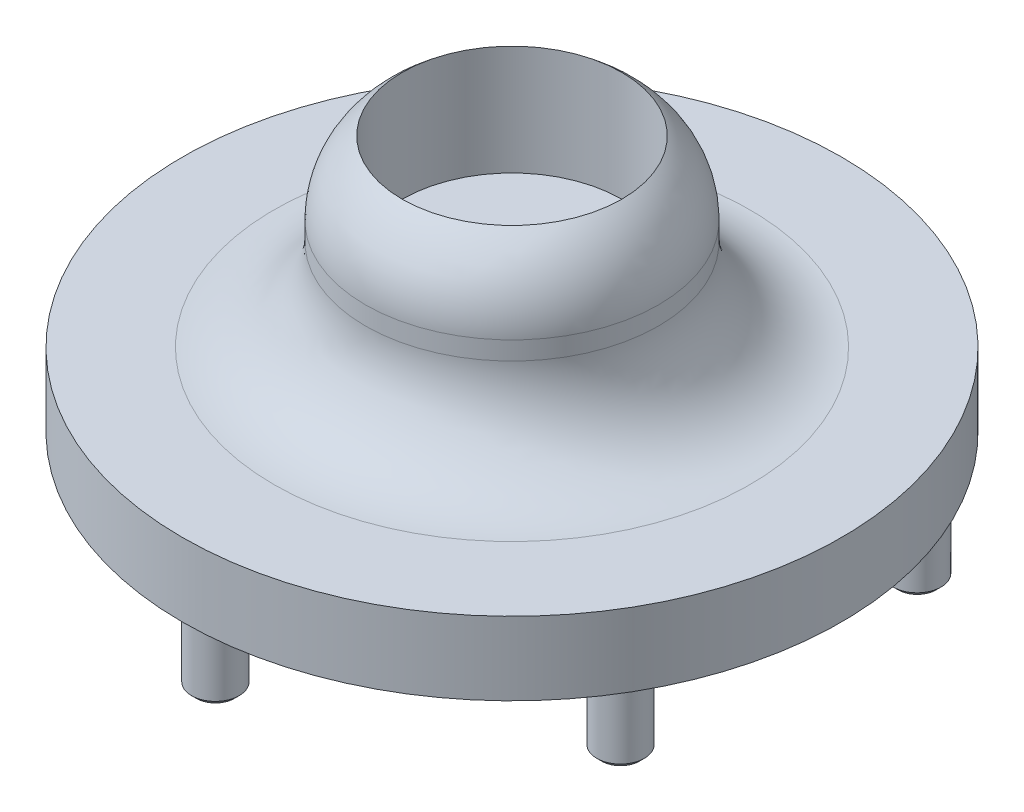
ISO-10303-21;
HEADER;
FILE_DESCRIPTION(('STEP AP214'),'2;1');
FILE_NAME('part.step','',(''),(''),'','','');
FILE_SCHEMA(('AUTOMOTIVE_DESIGN { 1 0 10303 214 1 1 1 1 }'));
ENDSEC;
DATA;
#1=APPLICATION_CONTEXT('core data for automotive mechanical design processes');
#2=APPLICATION_PROTOCOL_DEFINITION('international standard','automotive_design',2000,#1);
#3=PRODUCT_CONTEXT('',#1,'mechanical');
#4=PRODUCT('Part','Part','',(#3));
#5=PRODUCT_RELATED_PRODUCT_CATEGORY('part','',(#4));
#6=PRODUCT_DEFINITION_FORMATION('','',#4);
#7=PRODUCT_DEFINITION_CONTEXT('part definition',#1,'design');
#8=PRODUCT_DEFINITION('design','',#6,#7);
#9=PRODUCT_DEFINITION_SHAPE('','',#8);
#10=(LENGTH_UNIT() NAMED_UNIT(*) SI_UNIT(.MILLI.,.METRE.));
#11=(NAMED_UNIT(*) PLANE_ANGLE_UNIT() SI_UNIT($,.RADIAN.));
#12=(NAMED_UNIT(*) SI_UNIT($,.STERADIAN.) SOLID_ANGLE_UNIT());
#13=UNCERTAINTY_MEASURE_WITH_UNIT(LENGTH_MEASURE(1.E-05),#10,'distance_accuracy_value','');
#14=(GEOMETRIC_REPRESENTATION_CONTEXT(3) GLOBAL_UNCERTAINTY_ASSIGNED_CONTEXT((#13)) GLOBAL_UNIT_ASSIGNED_CONTEXT((#10,
#11,#12)) REPRESENTATION_CONTEXT('',''));
#15=CARTESIAN_POINT('',(0.,0.,0.));
#16=DIRECTION('',(0.,0.,1.));
#17=DIRECTION('',(1.,0.,0.));
#18=AXIS2_PLACEMENT_3D('',#15,#16,#17);
#19=CARTESIAN_POINT('',(0.,0.,0.));
#20=DIRECTION('',(0.,-1.,0.));
#21=DIRECTION('',(0.,0.,-1.));
#22=AXIS2_PLACEMENT_3D('',#19,#20,#21);
#23=PLANE('',#22);
#24=CARTESIAN_POINT('',(0.,0.,0.));
#25=DIRECTION('',(0.,-1.,0.));
#26=DIRECTION('',(0.,0.,-1.));
#27=AXIS2_PLACEMENT_3D('',#24,#25,#26);
#28=CIRCLE('',#27,24.2148768863045);
#29=CARTESIAN_POINT('',(0.,0.,-24.2148768863045));
#30=VERTEX_POINT('',#29);
#31=EDGE_CURVE('E82',#30,#30,#28,.T.);
#32=ORIENTED_EDGE('',*,*,#31,.T.);
#33=EDGE_LOOP('',(#32));
#34=FACE_BOUND('',#33,.T.);
#35=ADVANCED_FACE('F37',(#34),#23,.T.);
#36=CARTESIAN_POINT('',(0.,119.074074074074,0.));
#37=DIRECTION('',(0.,1.,0.));
#38=DIRECTION('',(0.,0.,1.));
#39=AXIS2_PLACEMENT_3D('',#36,#37,#38);
#40=CYLINDRICAL_SURFACE('',#39,75.);
#41=CARTESIAN_POINT('',(0.,45.,0.));
#42=DIRECTION('',(0.,1.,0.));
#43=DIRECTION('',(0.,0.,1.));
#44=AXIS2_PLACEMENT_3D('',#41,#42,#43);
#45=CIRCLE('',#44,75.);
#46=CARTESIAN_POINT('',(0.,45.,75.));
#47=VERTEX_POINT('',#46);
#48=EDGE_CURVE('E97',#47,#47,#45,.T.);
#49=ORIENTED_EDGE('',*,*,#48,.T.);
#50=EDGE_LOOP('',(#49));
#51=FACE_BOUND('',#50,.T.);
#52=CARTESIAN_POINT('',(0.,59.0740740740741,0.));
#53=DIRECTION('',(0.,1.,0.));
#54=DIRECTION('',(0.,0.,1.));
#55=AXIS2_PLACEMENT_3D('',#52,#53,#54);
#56=CIRCLE('',#55,75.);
#57=CARTESIAN_POINT('',(0.,59.0740740740741,75.));
#58=VERTEX_POINT('',#57);
#59=EDGE_CURVE('E100',#58,#58,#56,.T.);
#60=ORIENTED_EDGE('',*,*,#59,.F.);
#61=EDGE_LOOP('',(#60));
#62=FACE_BOUND('',#61,.T.);
#63=ADVANCED_FACE('F140',(#51,#62),#40,.T.);
#64=CARTESIAN_POINT('',(-75.,59.0740740740741,0.));
#65=DIRECTION('',(0.,-1.,0.));
#66=DIRECTION('',(0.,0.,-1.));
#67=AXIS2_PLACEMENT_3D('',#64,#65,#66);
#68=PLANE('',#67);
#69=CARTESIAN_POINT('',(-105.222086559809,59.0740740740741,60.7500000000012));
#70=DIRECTION('',(0.,-1.,0.));
#71=DIRECTION('',(0.866025403784433,0.,-0.50000000000001));
#72=AXIS2_PLACEMENT_3D('',#69,#70,#71);
#73=CIRCLE('',#72,9.75);
#74=CARTESIAN_POINT('',(-96.7783388729104,59.0740740740741,55.8750000000011));
#75=VERTEX_POINT('',#74);
#76=EDGE_CURVE('E130',#75,#75,#73,.T.);
#77=ORIENTED_EDGE('',*,*,#76,.F.);
#78=EDGE_LOOP('',(#77));
#79=FACE_BOUND('',#78,.T.);
#80=CARTESIAN_POINT('',(-105.22208655981,59.0740740740741,-60.749999999999));
#81=DIRECTION('',(0.,-1.,0.));
#82=DIRECTION('',(0.866025403784443,0.,0.499999999999992));
#83=AXIS2_PLACEMENT_3D('',#80,#81,#82);
#84=CIRCLE('',#83,9.75);
#85=CARTESIAN_POINT('',(-96.7783388729115,59.0740740740741,-55.8749999999991));
#86=VERTEX_POINT('',#85);
#87=EDGE_CURVE('E127',#86,#86,#84,.T.);
#88=ORIENTED_EDGE('',*,*,#87,.F.);
#89=EDGE_LOOP('',(#88));
#90=FACE_BOUND('',#89,.T.);
#91=CARTESIAN_POINT('',(0.,59.0740740740741,-121.5));
#92=DIRECTION('',(0.,-1.,0.));
#93=DIRECTION('',(0.,0.,1.));
#94=AXIS2_PLACEMENT_3D('',#91,#92,#93);
#95=CIRCLE('',#94,9.75);
#96=CARTESIAN_POINT('',(0.,59.0740740740741,-111.75));
#97=VERTEX_POINT('',#96);
#98=EDGE_CURVE('E124',#97,#97,#95,.T.);
#99=ORIENTED_EDGE('',*,*,#98,.F.);
#100=EDGE_LOOP('',(#99));
#101=FACE_BOUND('',#100,.T.);
#102=CARTESIAN_POINT('',(105.222086559809,59.0740740740741,-60.7500000000005));
#103=DIRECTION('',(0.,-1.,0.));
#104=DIRECTION('',(-0.866025403784436,0.,0.500000000000004));
#105=AXIS2_PLACEMENT_3D('',#102,#103,#104);
#106=CIRCLE('',#105,9.75);
#107=CARTESIAN_POINT('',(96.7783388729108,59.0740740740741,-55.8750000000005));
#108=VERTEX_POINT('',#107);
#109=EDGE_CURVE('E121',#108,#108,#106,.T.);
#110=ORIENTED_EDGE('',*,*,#109,.F.);
#111=EDGE_LOOP('',(#110));
#112=FACE_BOUND('',#111,.T.);
#113=CARTESIAN_POINT('',(105.222086559809,59.0740740740741,60.7499999999998));
#114=DIRECTION('',(0.,-1.,0.));
#115=DIRECTION('',(-0.86602540378444,0.,-0.499999999999998));
#116=AXIS2_PLACEMENT_3D('',#113,#114,#115);
#117=CIRCLE('',#116,9.75);
#118=CARTESIAN_POINT('',(96.7783388729111,59.0740740740741,55.8749999999998));
#119=VERTEX_POINT('',#118);
#120=EDGE_CURVE('E118',#119,#119,#117,.T.);
#121=ORIENTED_EDGE('',*,*,#120,.F.);
#122=EDGE_LOOP('',(#121));
#123=FACE_BOUND('',#122,.T.);
#124=CARTESIAN_POINT('',(0.,59.0740740740741,121.5));
#125=DIRECTION('',(0.,-1.,0.));
#126=DIRECTION('',(0.,0.,-1.));
#127=AXIS2_PLACEMENT_3D('',#124,#125,#126);
#128=CIRCLE('',#127,9.75);
#129=CARTESIAN_POINT('',(0.,59.0740740740741,111.75));
#130=VERTEX_POINT('',#129);
#131=EDGE_CURVE('E115',#130,#130,#128,.T.);
#132=ORIENTED_EDGE('',*,*,#131,.F.);
#133=EDGE_LOOP('',(#132));
#134=FACE_BOUND('',#133,.T.);
#135=ORIENTED_EDGE('',*,*,#59,.T.);
#136=EDGE_LOOP('',(#135));
#137=FACE_BOUND('',#136,.T.);
#138=CARTESIAN_POINT('',(0.,59.0740740740741,0.));
#139=DIRECTION('',(0.,1.,0.));
#140=DIRECTION('',(0.,0.,1.));
#141=AXIS2_PLACEMENT_3D('',#138,#139,#140);
#142=CIRCLE('',#141,135.);
#143=CARTESIAN_POINT('',(0.,59.0740740740741,135.));
#144=VERTEX_POINT('',#143);
#145=EDGE_CURVE('E103',#144,#144,#142,.T.);
#146=ORIENTED_EDGE('',*,*,#145,.F.);
#147=EDGE_LOOP('',(#146));
#148=FACE_BOUND('',#147,.T.);
#149=ADVANCED_FACE('F136',(#79,#90,#101,#112,#123,#134,#137,#148),#68,.T.);
#150=CARTESIAN_POINT('',(0.,119.074074074074,0.));
#151=DIRECTION('',(0.,1.,0.));
#152=DIRECTION('',(0.,0.,1.));
#153=AXIS2_PLACEMENT_3D('',#150,#151,#152);
#154=CYLINDRICAL_SURFACE('',#153,135.);
#155=ORIENTED_EDGE('',*,*,#145,.T.);
#156=EDGE_LOOP('',(#155));
#157=FACE_BOUND('',#156,.T.);
#158=CARTESIAN_POINT('',(0.,89.0740740740741,0.));
#159=DIRECTION('',(0.,1.,0.));
#160=DIRECTION('',(0.,0.,1.));
#161=AXIS2_PLACEMENT_3D('',#158,#159,#160);
#162=CIRCLE('',#161,135.);
#163=CARTESIAN_POINT('',(0.,89.0740740740741,135.));
#164=VERTEX_POINT('',#163);
#165=EDGE_CURVE('E106',#164,#164,#162,.T.);
#166=ORIENTED_EDGE('',*,*,#165,.F.);
#167=EDGE_LOOP('',(#166));
#168=FACE_BOUND('',#167,.T.);
#169=ADVANCED_FACE('F139',(#157,#168),#154,.T.);
#170=CARTESIAN_POINT('',(-135.,89.0740740740741,0.));
#171=DIRECTION('',(0.,1.,0.));
#172=DIRECTION('',(0.,0.,1.));
#173=AXIS2_PLACEMENT_3D('',#170,#171,#172);
#174=PLANE('',#173);
#175=CARTESIAN_POINT('',(0.,89.0740740740741,0.));
#176=DIRECTION('',(0.,1.,0.));
#177=DIRECTION('',(0.,0.,1.));
#178=AXIS2_PLACEMENT_3D('',#175,#176,#177);
#179=CIRCLE('',#178,97.5);
#180=CARTESIAN_POINT('',(0.,89.0740740740741,97.5));
#181=VERTEX_POINT('',#180);
#182=EDGE_CURVE('E88',#181,#181,#179,.F.);
#183=ORIENTED_EDGE('',*,*,#182,.T.);
#184=EDGE_LOOP('',(#183));
#185=FACE_BOUND('',#184,.T.);
#186=ORIENTED_EDGE('',*,*,#165,.T.);
#187=EDGE_LOOP('',(#186));
#188=FACE_BOUND('',#187,.T.);
#189=ADVANCED_FACE('F158',(#185,#188),#174,.T.);
#190=CARTESIAN_POINT('',(0.,119.074074074074,0.));
#191=DIRECTION('',(0.,1.,0.));
#192=DIRECTION('',(0.,0.,1.));
#193=AXIS2_PLACEMENT_3D('',#190,#191,#192);
#194=CYLINDRICAL_SURFACE('',#193,60.);
#195=CARTESIAN_POINT('',(0.,134.074074074074,0.));
#196=DIRECTION('',(0.,1.,0.));
#197=DIRECTION('',(0.,0.,1.));
#198=AXIS2_PLACEMENT_3D('',#195,#196,#197);
#199=CIRCLE('',#198,60.);
#200=CARTESIAN_POINT('',(0.,134.074074074074,60.));
#201=VERTEX_POINT('',#200);
#202=EDGE_CURVE('E91',#201,#201,#199,.F.);
#203=ORIENTED_EDGE('',*,*,#202,.T.);
#204=EDGE_LOOP('',(#203));
#205=FACE_BOUND('',#204,.T.);
#206=CARTESIAN_POINT('',(0.,126.574074074074,0.));
#207=DIRECTION('',(0.,1.,0.));
#208=DIRECTION('',(0.,0.,1.));
#209=AXIS2_PLACEMENT_3D('',#206,#207,#208);
#210=CIRCLE('',#209,60.);
#211=CARTESIAN_POINT('',(0.,126.574074074074,60.));
#212=VERTEX_POINT('',#211);
#213=EDGE_CURVE('E94',#212,#212,#210,.T.);
#214=ORIENTED_EDGE('',*,*,#213,.T.);
#215=EDGE_LOOP('',(#214));
#216=FACE_BOUND('',#215,.T.);
#217=ADVANCED_FACE('F163',(#205,#216),#194,.T.);
#218=CARTESIAN_POINT('',(0.,119.074074074074,0.));
#219=DIRECTION('',(0.,1.,0.));
#220=DIRECTION('',(0.,0.,1.));
#221=AXIS2_PLACEMENT_3D('',#218,#219,#220);
#222=CYLINDRICAL_SURFACE('',#221,45.);
#223=CARTESIAN_POINT('',(0.,164.074074074074,0.));
#224=DIRECTION('',(0.,1.,0.));
#225=DIRECTION('',(0.,0.,1.));
#226=AXIS2_PLACEMENT_3D('',#223,#224,#225);
#227=CIRCLE('',#226,45.);
#228=CARTESIAN_POINT('',(0.,164.074074074074,45.));
#229=VERTEX_POINT('',#228);
#230=EDGE_CURVE('E109',#229,#229,#227,.T.);
#231=ORIENTED_EDGE('',*,*,#230,.T.);
#232=EDGE_LOOP('',(#231));
#233=FACE_BOUND('',#232,.T.);
#234=CARTESIAN_POINT('',(0.,119.074074074074,0.));
#235=DIRECTION('',(0.,1.,0.));
#236=DIRECTION('',(0.,0.,1.));
#237=AXIS2_PLACEMENT_3D('',#234,#235,#236);
#238=CIRCLE('',#237,45.);
#239=CARTESIAN_POINT('',(0.,119.074074074074,45.));
#240=VERTEX_POINT('',#239);
#241=EDGE_CURVE('E112',#240,#240,#238,.T.);
#242=ORIENTED_EDGE('',*,*,#241,.F.);
#243=EDGE_LOOP('',(#242));
#244=FACE_BOUND('',#243,.T.);
#245=ADVANCED_FACE('F169',(#233,#244),#222,.F.);
#246=CARTESIAN_POINT('',(-45.,119.074074074074,0.));
#247=DIRECTION('',(0.,1.,0.));
#248=DIRECTION('',(0.,0.,1.));
#249=AXIS2_PLACEMENT_3D('',#246,#247,#248);
#250=PLANE('',#249);
#251=ORIENTED_EDGE('',*,*,#241,.T.);
#252=EDGE_LOOP('',(#251));
#253=FACE_BOUND('',#252,.T.);
#254=ADVANCED_FACE('F185',(#253),#250,.T.);
#255=CARTESIAN_POINT('',(0.,134.074074074074,0.));
#256=DIRECTION('',(0.,1.,0.));
#257=DIRECTION('',(0.,0.,1.));
#258=AXIS2_PLACEMENT_3D('',#255,#256,#257);
#259=DEGENERATE_TOROIDAL_SURFACE('',#258,22.5,37.5,.T.);
#260=ORIENTED_EDGE('',*,*,#202,.F.);
#261=EDGE_LOOP('',(#260));
#262=FACE_BOUND('',#261,.T.);
#263=ORIENTED_EDGE('',*,*,#230,.F.);
#264=EDGE_LOOP('',(#263));
#265=FACE_BOUND('',#264,.T.);
#266=ADVANCED_FACE('F181',(#262,#265),#259,.T.);
#267=CARTESIAN_POINT('',(0.,126.574074074074,0.));
#268=DIRECTION('',(0.,1.,0.));
#269=DIRECTION('',(0.,0.,1.));
#270=AXIS2_PLACEMENT_3D('',#267,#268,#269);
#271=TOROIDAL_SURFACE('',#270,97.5,37.5);
#272=ORIENTED_EDGE('',*,*,#182,.F.);
#273=EDGE_LOOP('',(#272));
#274=FACE_BOUND('',#273,.T.);
#275=ORIENTED_EDGE('',*,*,#213,.F.);
#276=EDGE_LOOP('',(#275));
#277=FACE_BOUND('',#276,.T.);
#278=ADVANCED_FACE('F184',(#274,#277),#271,.F.);
#279=CARTESIAN_POINT('',(0.,8.25765385825231,0.));
#280=DIRECTION('',(0.,1.,0.));
#281=DIRECTION('',(0.,0.,1.));
#282=AXIS2_PLACEMENT_3D('',#279,#280,#281);
#283=TOROIDAL_SURFACE('',#282,82.5,37.5);
#284=CARTESIAN_POINT('',(0.,17.1591201968446,0.));
#285=DIRECTION('',(0.,-1.,0.));
#286=DIRECTION('',(0.,0.,-1.));
#287=AXIS2_PLACEMENT_3D('',#284,#285,#286);
#288=CIRCLE('',#287,46.0717980539403);
#289=CARTESIAN_POINT('',(0.,17.1591201968446,-46.0717980539403));
#290=VERTEX_POINT('',#289);
#291=EDGE_CURVE('E85',#290,#290,#288,.F.);
#292=ORIENTED_EDGE('',*,*,#291,.T.);
#293=EDGE_LOOP('',(#292));
#294=FACE_BOUND('',#293,.T.);
#295=ORIENTED_EDGE('',*,*,#48,.F.);
#296=EDGE_LOOP('',(#295));
#297=FACE_BOUND('',#296,.T.);
#298=ADVANCED_FACE('F189',(#294,#297),#283,.F.);
#299=CARTESIAN_POINT('',(0.,22.5,0.));
#300=DIRECTION('',(0.,1.,0.));
#301=DIRECTION('',(0.,0.,1.));
#302=AXIS2_PLACEMENT_3D('',#299,#300,#301);
#303=TOROIDAL_SURFACE('',#302,24.2148768863045,22.5);
#304=ORIENTED_EDGE('',*,*,#31,.F.);
#305=EDGE_LOOP('',(#304));
#306=FACE_BOUND('',#305,.T.);
#307=ORIENTED_EDGE('',*,*,#291,.F.);
#308=EDGE_LOOP('',(#307));
#309=FACE_BOUND('',#308,.T.);
#310=ADVANCED_FACE('F193',(#306,#309),#303,.T.);
#311=CARTESIAN_POINT('',(0.,29.0740740740741,121.5));
#312=DIRECTION('',(0.,1.,0.));
#313=DIRECTION('',(0.,0.,1.));
#314=AXIS2_PLACEMENT_3D('',#311,#312,#313);
#315=CYLINDRICAL_SURFACE('',#314,9.75);
#316=CARTESIAN_POINT('',(0.,31.0740740740741,121.5));
#317=DIRECTION('',(0.,-1.,0.));
#318=DIRECTION('',(0.,0.,-1.));
#319=AXIS2_PLACEMENT_3D('',#316,#317,#318);
#320=CIRCLE('',#319,9.75);
#321=CARTESIAN_POINT('',(0.,31.0740740740741,111.75));
#322=VERTEX_POINT('',#321);
#323=EDGE_CURVE('E76',#322,#322,#320,.F.);
#324=ORIENTED_EDGE('',*,*,#323,.T.);
#325=EDGE_LOOP('',(#324));
#326=FACE_BOUND('',#325,.T.);
#327=ORIENTED_EDGE('',*,*,#131,.T.);
#328=EDGE_LOOP('',(#327));
#329=FACE_BOUND('',#328,.T.);
#330=ADVANCED_FACE('F197',(#326,#329),#315,.T.);
#331=CARTESIAN_POINT('',(0.,29.0740740740741,121.5));
#332=DIRECTION('',(0.,-1.,0.));
#333=DIRECTION('',(0.,0.,-1.));
#334=AXIS2_PLACEMENT_3D('',#331,#332,#333);
#335=PLANE('',#334);
#336=CARTESIAN_POINT('',(0.,29.0740740740741,121.5));
#337=DIRECTION('',(0.,-1.,0.));
#338=DIRECTION('',(0.,0.,-1.));
#339=AXIS2_PLACEMENT_3D('',#336,#337,#338);
#340=CIRCLE('',#339,7.74999999999998);
#341=CARTESIAN_POINT('',(0.,29.0740740740741,113.75));
#342=VERTEX_POINT('',#341);
#343=EDGE_CURVE('E79',#342,#342,#340,.T.);
#344=ORIENTED_EDGE('',*,*,#343,.T.);
#345=EDGE_LOOP('',(#344));
#346=FACE_BOUND('',#345,.T.);
#347=ADVANCED_FACE('F207',(#346),#335,.T.);
#348=CARTESIAN_POINT('',(0.,29.0740740740741,121.5));
#349=DIRECTION('',(0.,1.,0.));
#350=DIRECTION('',(0.,0.,1.));
#351=AXIS2_PLACEMENT_3D('',#348,#349,#350);
#352=CONICAL_SURFACE('',#351,7.74999999999998,0.785398163397443);
#353=ORIENTED_EDGE('',*,*,#323,.F.);
#354=EDGE_LOOP('',(#353));
#355=FACE_BOUND('',#354,.T.);
#356=ORIENTED_EDGE('',*,*,#343,.F.);
#357=EDGE_LOOP('',(#356));
#358=FACE_BOUND('',#357,.T.);
#359=ADVANCED_FACE('F200',(#355,#358),#352,.T.);
#360=CARTESIAN_POINT('',(105.222086559809,29.0740740740741,60.7499999999998));
#361=DIRECTION('',(0.,1.,0.));
#362=DIRECTION('',(0.,0.,1.));
#363=AXIS2_PLACEMENT_3D('',#360,#361,#362);
#364=CYLINDRICAL_SURFACE('',#363,9.75);
#365=CARTESIAN_POINT('',(105.222086559809,31.074074074074,60.7499999999998));
#366=DIRECTION('',(0.,-1.,0.));
#367=DIRECTION('',(0.,0.,-1.));
#368=AXIS2_PLACEMENT_3D('',#365,#366,#367);
#369=CIRCLE('',#368,9.75);
#370=CARTESIAN_POINT('',(105.222086559809,31.074074074074,50.9999999999998));
#371=VERTEX_POINT('',#370);
#372=EDGE_CURVE('E70',#371,#371,#369,.F.);
#373=ORIENTED_EDGE('',*,*,#372,.T.);
#374=EDGE_LOOP('',(#373));
#375=FACE_BOUND('',#374,.T.);
#376=ORIENTED_EDGE('',*,*,#120,.T.);
#377=EDGE_LOOP('',(#376));
#378=FACE_BOUND('',#377,.T.);
#379=ADVANCED_FACE('F206',(#375,#378),#364,.T.);
#380=CARTESIAN_POINT('',(105.222086559809,29.0740740740741,60.7499999999998));
#381=DIRECTION('',(0.,-1.,0.));
#382=DIRECTION('',(-0.86602540378444,0.,-0.499999999999998));
#383=AXIS2_PLACEMENT_3D('',#380,#381,#382);
#384=PLANE('',#383);
#385=CARTESIAN_POINT('',(105.222086559809,29.0740740740741,60.7499999999998));
#386=DIRECTION('',(0.,-1.,0.));
#387=DIRECTION('',(0.,0.,-1.));
#388=AXIS2_PLACEMENT_3D('',#385,#386,#387);
#389=CIRCLE('',#388,7.75000000000008);
#390=CARTESIAN_POINT('',(105.222086559809,29.0740740740741,52.9999999999997));
#391=VERTEX_POINT('',#390);
#392=EDGE_CURVE('E73',#391,#391,#389,.T.);
#393=ORIENTED_EDGE('',*,*,#392,.T.);
#394=EDGE_LOOP('',(#393));
#395=FACE_BOUND('',#394,.T.);
#396=ADVANCED_FACE('F271',(#395),#384,.T.);
#397=CARTESIAN_POINT('',(105.222086559809,29.0740740740741,-60.7500000000005));
#398=DIRECTION('',(0.,1.,0.));
#399=DIRECTION('',(0.,0.,1.));
#400=AXIS2_PLACEMENT_3D('',#397,#398,#399);
#401=CYLINDRICAL_SURFACE('',#400,9.75);
#402=CARTESIAN_POINT('',(105.222086559809,31.0740740740741,-60.7500000000005));
#403=DIRECTION('',(0.,-1.,0.));
#404=DIRECTION('',(0.,0.,-1.));
#405=AXIS2_PLACEMENT_3D('',#402,#403,#404);
#406=CIRCLE('',#405,9.75);
#407=CARTESIAN_POINT('',(105.222086559809,31.0740740740741,-70.5000000000005));
#408=VERTEX_POINT('',#407);
#409=EDGE_CURVE('E64',#408,#408,#406,.F.);
#410=ORIENTED_EDGE('',*,*,#409,.T.);
#411=EDGE_LOOP('',(#410));
#412=FACE_BOUND('',#411,.T.);
#413=ORIENTED_EDGE('',*,*,#109,.T.);
#414=EDGE_LOOP('',(#413));
#415=FACE_BOUND('',#414,.T.);
#416=ADVANCED_FACE('F267',(#412,#415),#401,.T.);
#417=CARTESIAN_POINT('',(105.222086559809,29.0740740740741,-60.7500000000005));
#418=DIRECTION('',(0.,-1.,0.));
#419=DIRECTION('',(-0.866025403784436,0.,0.500000000000004));
#420=AXIS2_PLACEMENT_3D('',#417,#418,#419);
#421=PLANE('',#420);
#422=CARTESIAN_POINT('',(105.222086559809,29.0740740740741,-60.7500000000005));
#423=DIRECTION('',(0.,-1.,0.));
#424=DIRECTION('',(0.,0.,-1.));
#425=AXIS2_PLACEMENT_3D('',#422,#423,#424);
#426=CIRCLE('',#425,7.75);
#427=CARTESIAN_POINT('',(105.222086559809,29.0740740740741,-68.5000000000005));
#428=VERTEX_POINT('',#427);
#429=EDGE_CURVE('E67',#428,#428,#426,.T.);
#430=ORIENTED_EDGE('',*,*,#429,.T.);
#431=EDGE_LOOP('',(#430));
#432=FACE_BOUND('',#431,.T.);
#433=ADVANCED_FACE('F263',(#432),#421,.T.);
#434=CARTESIAN_POINT('',(0.,29.0740740740741,-121.5));
#435=DIRECTION('',(0.,1.,0.));
#436=DIRECTION('',(0.,0.,1.));
#437=AXIS2_PLACEMENT_3D('',#434,#435,#436);
#438=CYLINDRICAL_SURFACE('',#437,9.75);
#439=CARTESIAN_POINT('',(0.,31.0740740740741,-121.5));
#440=DIRECTION('',(0.,-1.,0.));
#441=DIRECTION('',(0.,0.,-1.));
#442=AXIS2_PLACEMENT_3D('',#439,#440,#441);
#443=CIRCLE('',#442,9.75);
#444=CARTESIAN_POINT('',(0.,31.0740740740741,-131.25));
#445=VERTEX_POINT('',#444);
#446=EDGE_CURVE('E58',#445,#445,#443,.F.);
#447=ORIENTED_EDGE('',*,*,#446,.T.);
#448=EDGE_LOOP('',(#447));
#449=FACE_BOUND('',#448,.T.);
#450=ORIENTED_EDGE('',*,*,#98,.T.);
#451=EDGE_LOOP('',(#450));
#452=FACE_BOUND('',#451,.T.);
#453=ADVANCED_FACE('F259',(#449,#452),#438,.T.);
#454=CARTESIAN_POINT('',(0.,29.0740740740741,-121.5));
#455=DIRECTION('',(0.,-1.,0.));
#456=DIRECTION('',(0.,0.,1.));
#457=AXIS2_PLACEMENT_3D('',#454,#455,#456);
#458=PLANE('',#457);
#459=CARTESIAN_POINT('',(0.,29.0740740740741,-121.5));
#460=DIRECTION('',(0.,-1.,0.));
#461=DIRECTION('',(0.,0.,-1.));
#462=AXIS2_PLACEMENT_3D('',#459,#460,#461);
#463=CIRCLE('',#462,7.74999999999998);
#464=CARTESIAN_POINT('',(0.,29.0740740740741,-129.25));
#465=VERTEX_POINT('',#464);
#466=EDGE_CURVE('E61',#465,#465,#463,.T.);
#467=ORIENTED_EDGE('',*,*,#466,.T.);
#468=EDGE_LOOP('',(#467));
#469=FACE_BOUND('',#468,.T.);
#470=ADVANCED_FACE('F252',(#469),#458,.T.);
#471=CARTESIAN_POINT('',(-105.22208655981,29.0740740740741,-60.749999999999));
#472=DIRECTION('',(0.,1.,0.));
#473=DIRECTION('',(0.,0.,1.));
#474=AXIS2_PLACEMENT_3D('',#471,#472,#473);
#475=CYLINDRICAL_SURFACE('',#474,9.75);
#476=CARTESIAN_POINT('',(-105.22208655981,31.0740740740741,-60.749999999999));
#477=DIRECTION('',(0.,-1.,0.));
#478=DIRECTION('',(0.,0.,-1.));
#479=AXIS2_PLACEMENT_3D('',#476,#477,#478);
#480=CIRCLE('',#479,9.75);
#481=CARTESIAN_POINT('',(-105.22208655981,31.0740740740741,-70.499999999999));
#482=VERTEX_POINT('',#481);
#483=EDGE_CURVE('E49',#482,#482,#480,.F.);
#484=ORIENTED_EDGE('',*,*,#483,.T.);
#485=EDGE_LOOP('',(#484));
#486=FACE_BOUND('',#485,.T.);
#487=ORIENTED_EDGE('',*,*,#87,.T.);
#488=EDGE_LOOP('',(#487));
#489=FACE_BOUND('',#488,.T.);
#490=ADVANCED_FACE('F245',(#486,#489),#475,.T.);
#491=CARTESIAN_POINT('',(-105.22208655981,29.0740740740741,-60.749999999999));
#492=DIRECTION('',(0.,-1.,0.));
#493=DIRECTION('',(0.866025403784443,0.,0.499999999999992));
#494=AXIS2_PLACEMENT_3D('',#491,#492,#493);
#495=PLANE('',#494);
#496=CARTESIAN_POINT('',(-105.22208655981,29.0740740740741,-60.749999999999));
#497=DIRECTION('',(0.,-1.,0.));
#498=DIRECTION('',(0.,0.,-1.));
#499=AXIS2_PLACEMENT_3D('',#496,#497,#498);
#500=CIRCLE('',#499,7.74999999999999);
#501=CARTESIAN_POINT('',(-105.22208655981,29.0740740740741,-68.499999999999));
#502=VERTEX_POINT('',#501);
#503=EDGE_CURVE('E53',#502,#502,#500,.T.);
#504=ORIENTED_EDGE('',*,*,#503,.T.);
#505=EDGE_LOOP('',(#504));
#506=FACE_BOUND('',#505,.T.);
#507=ADVANCED_FACE('F243',(#506),#495,.T.);
#508=CARTESIAN_POINT('',(-105.222086559809,29.0740740740741,60.7500000000012));
#509=DIRECTION('',(0.,1.,0.));
#510=DIRECTION('',(0.,0.,1.));
#511=AXIS2_PLACEMENT_3D('',#508,#509,#510);
#512=CYLINDRICAL_SURFACE('',#511,9.75);
#513=CARTESIAN_POINT('',(-105.222086559809,31.0740740740741,60.7500000000012));
#514=DIRECTION('',(0.,-1.,0.));
#515=DIRECTION('',(0.,0.,-1.));
#516=AXIS2_PLACEMENT_3D('',#513,#514,#515);
#517=CIRCLE('',#516,9.75);
#518=CARTESIAN_POINT('',(-105.222086559809,31.0740740740741,51.0000000000012));
#519=VERTEX_POINT('',#518);
#520=EDGE_CURVE('E10',#519,#519,#517,.F.);
#521=ORIENTED_EDGE('',*,*,#520,.T.);
#522=EDGE_LOOP('',(#521));
#523=FACE_BOUND('',#522,.T.);
#524=ORIENTED_EDGE('',*,*,#76,.T.);
#525=EDGE_LOOP('',(#524));
#526=FACE_BOUND('',#525,.T.);
#527=ADVANCED_FACE('F134',(#523,#526),#512,.T.);
#528=CARTESIAN_POINT('',(-105.222086559809,29.0740740740741,60.7500000000012));
#529=DIRECTION('',(0.,-1.,0.));
#530=DIRECTION('',(0.866025403784433,0.,-0.50000000000001));
#531=AXIS2_PLACEMENT_3D('',#528,#529,#530);
#532=PLANE('',#531);
#533=CARTESIAN_POINT('',(-105.222086559809,29.0740740740741,60.7500000000012));
#534=DIRECTION('',(0.,-1.,0.));
#535=DIRECTION('',(0.,0.,-1.));
#536=AXIS2_PLACEMENT_3D('',#533,#534,#535);
#537=CIRCLE('',#536,7.74999999999996);
#538=CARTESIAN_POINT('',(-105.222086559809,29.0740740740741,53.0000000000013));
#539=VERTEX_POINT('',#538);
#540=EDGE_CURVE('E45',#539,#539,#537,.T.);
#541=ORIENTED_EDGE('',*,*,#540,.T.);
#542=EDGE_LOOP('',(#541));
#543=FACE_BOUND('',#542,.T.);
#544=ADVANCED_FACE('F216',(#543),#532,.T.);
#545=CARTESIAN_POINT('',(105.222086559809,29.0740740740741,60.7499999999998));
#546=DIRECTION('',(0.,1.,0.));
#547=DIRECTION('',(0.,0.,1.));
#548=AXIS2_PLACEMENT_3D('',#545,#546,#547);
#549=CONICAL_SURFACE('',#548,7.75000000000008,0.785398163397446);
#550=ORIENTED_EDGE('',*,*,#372,.F.);
#551=EDGE_LOOP('',(#550));
#552=FACE_BOUND('',#551,.T.);
#553=ORIENTED_EDGE('',*,*,#392,.F.);
#554=EDGE_LOOP('',(#553));
#555=FACE_BOUND('',#554,.T.);
#556=ADVANCED_FACE('F209',(#552,#555),#549,.T.);
#557=CARTESIAN_POINT('',(105.222086559809,29.0740740740741,-60.7500000000005));
#558=DIRECTION('',(0.,1.,0.));
#559=DIRECTION('',(0.,0.,1.));
#560=AXIS2_PLACEMENT_3D('',#557,#558,#559);
#561=CONICAL_SURFACE('',#560,7.75,0.785398163397439);
#562=ORIENTED_EDGE('',*,*,#409,.F.);
#563=EDGE_LOOP('',(#562));
#564=FACE_BOUND('',#563,.T.);
#565=ORIENTED_EDGE('',*,*,#429,.F.);
#566=EDGE_LOOP('',(#565));
#567=FACE_BOUND('',#566,.T.);
#568=ADVANCED_FACE('F215',(#564,#567),#561,.T.);
#569=CARTESIAN_POINT('',(0.,29.0740740740741,-121.5));
#570=DIRECTION('',(0.,1.,0.));
#571=DIRECTION('',(0.,0.,1.));
#572=AXIS2_PLACEMENT_3D('',#569,#570,#571);
#573=CONICAL_SURFACE('',#572,7.74999999999998,0.785398163397443);
#574=ORIENTED_EDGE('',*,*,#446,.F.);
#575=EDGE_LOOP('',(#574));
#576=FACE_BOUND('',#575,.T.);
#577=ORIENTED_EDGE('',*,*,#466,.F.);
#578=EDGE_LOOP('',(#577));
#579=FACE_BOUND('',#578,.T.);
#580=ADVANCED_FACE('F223',(#576,#579),#573,.T.);
#581=CARTESIAN_POINT('',(-105.22208655981,29.0740740740741,-60.749999999999));
#582=DIRECTION('',(0.,1.,0.));
#583=DIRECTION('',(0.,0.,1.));
#584=AXIS2_PLACEMENT_3D('',#581,#582,#583);
#585=CONICAL_SURFACE('',#584,7.75,0.785398163397438);
#586=ORIENTED_EDGE('',*,*,#483,.F.);
#587=EDGE_LOOP('',(#586));
#588=FACE_BOUND('',#587,.T.);
#589=ORIENTED_EDGE('',*,*,#503,.F.);
#590=EDGE_LOOP('',(#589));
#591=FACE_BOUND('',#590,.T.);
#592=ADVANCED_FACE('F229',(#588,#591),#585,.T.);
#593=CARTESIAN_POINT('',(-105.222086559809,29.0740740740741,60.7500000000012));
#594=DIRECTION('',(0.,1.,0.));
#595=DIRECTION('',(0.,0.,1.));
#596=AXIS2_PLACEMENT_3D('',#593,#594,#595);
#597=CONICAL_SURFACE('',#596,7.74999999999996,0.785398163397446);
#598=ORIENTED_EDGE('',*,*,#520,.F.);
#599=EDGE_LOOP('',(#598));
#600=FACE_BOUND('',#599,.T.);
#601=ORIENTED_EDGE('',*,*,#540,.F.);
#602=EDGE_LOOP('',(#601));
#603=FACE_BOUND('',#602,.T.);
#604=ADVANCED_FACE('F40',(#600,#603),#597,.T.);
#605=CLOSED_SHELL('',(#35,#63,#149,#169,#189,#217,#245,#254,#266,#278,#298,#310,#330,#347,#359,
#379,#396,#416,#433,#453,#470,#490,#507,#527,#544,#556,#568,#580,#592,#604));
#606=MANIFOLD_SOLID_BREP('B2',#605);
#607=ADVANCED_BREP_SHAPE_REPRESENTATION('',(#18,#606),#14);
#608=SHAPE_DEFINITION_REPRESENTATION(#9,#607);
ENDSEC;
END-ISO-10303-21;
